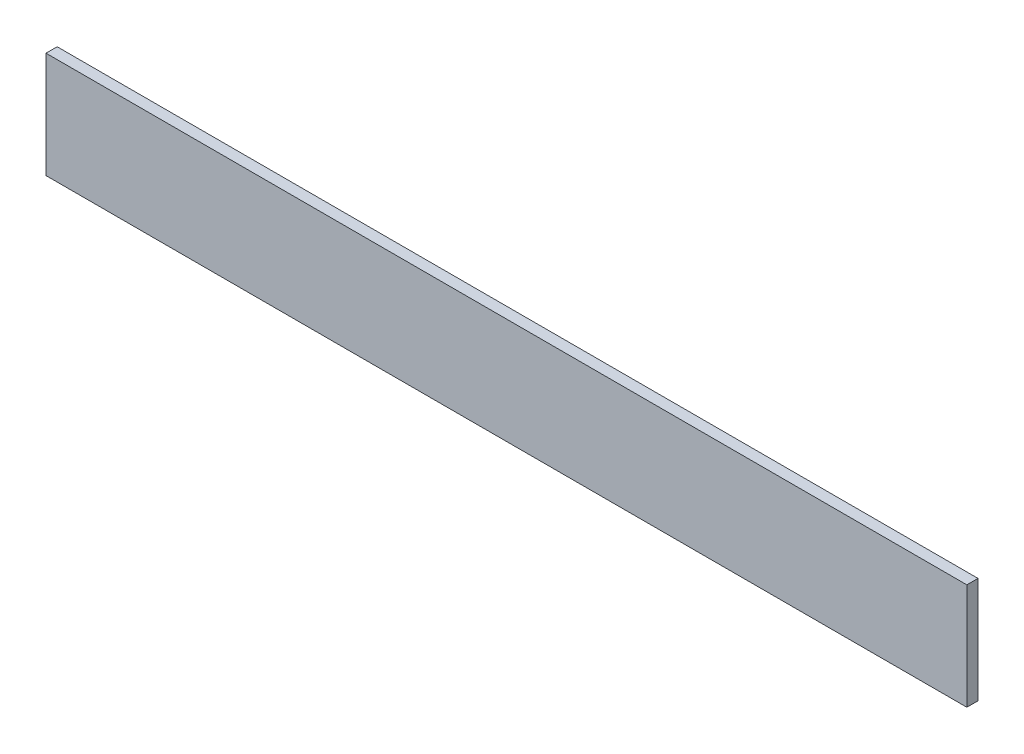
ISO-10303-21;
HEADER;
FILE_DESCRIPTION(('STEP AP214'),'2;1');
FILE_NAME('part.step','',(''),(''),'','','');
FILE_SCHEMA(('AUTOMOTIVE_DESIGN { 1 0 10303 214 1 1 1 1 }'));
ENDSEC;
DATA;
#1=APPLICATION_CONTEXT('core data for automotive mechanical design processes');
#2=APPLICATION_PROTOCOL_DEFINITION('international standard','automotive_design',2000,#1);
#3=PRODUCT_CONTEXT('',#1,'mechanical');
#4=PRODUCT('Part','Part','',(#3));
#5=PRODUCT_RELATED_PRODUCT_CATEGORY('part','',(#4));
#6=PRODUCT_DEFINITION_FORMATION('','',#4);
#7=PRODUCT_DEFINITION_CONTEXT('part definition',#1,'design');
#8=PRODUCT_DEFINITION('design','',#6,#7);
#9=PRODUCT_DEFINITION_SHAPE('','',#8);
#10=(LENGTH_UNIT() NAMED_UNIT(*) SI_UNIT(.MILLI.,.METRE.));
#11=(NAMED_UNIT(*) PLANE_ANGLE_UNIT() SI_UNIT($,.RADIAN.));
#12=(NAMED_UNIT(*) SI_UNIT($,.STERADIAN.) SOLID_ANGLE_UNIT());
#13=UNCERTAINTY_MEASURE_WITH_UNIT(LENGTH_MEASURE(1.E-05),#10,'distance_accuracy_value','');
#14=(GEOMETRIC_REPRESENTATION_CONTEXT(3) GLOBAL_UNCERTAINTY_ASSIGNED_CONTEXT((#13)) GLOBAL_UNIT_ASSIGNED_CONTEXT((#10,
#11,#12)) REPRESENTATION_CONTEXT('',''));
#15=CARTESIAN_POINT('',(0.,0.,0.));
#16=DIRECTION('',(0.,0.,1.));
#17=DIRECTION('',(1.,0.,0.));
#18=AXIS2_PLACEMENT_3D('',#15,#16,#17);
#19=CARTESIAN_POINT('',(0.,0.,8.));
#20=DIRECTION('',(1.,0.,0.));
#21=DIRECTION('',(0.,1.,0.));
#22=AXIS2_PLACEMENT_3D('',#19,#20,#21);
#23=PLANE('',#22);
#24=DIRECTION('',(0.,-1.,0.));
#25=VECTOR('',#24,1.);
#26=CARTESIAN_POINT('',(0.,0.,0.));
#27=LINE('',#26,#25);
#28=CARTESIAN_POINT('',(0.,0.,0.));
#29=VERTEX_POINT('',#28);
#30=CARTESIAN_POINT('',(0.,-76.,0.));
#31=VERTEX_POINT('',#30);
#32=EDGE_CURVE('E98',#29,#31,#27,.T.);
#33=ORIENTED_EDGE('',*,*,#32,.T.);
#34=DIRECTION('',(0.,0.,-1.));
#35=VECTOR('',#34,1.);
#36=CARTESIAN_POINT('',(0.,-76.,8.));
#37=LINE('',#36,#35);
#38=CARTESIAN_POINT('',(0.,-76.,8.));
#39=VERTEX_POINT('',#38);
#40=EDGE_CURVE('E11',#39,#31,#37,.T.);
#41=ORIENTED_EDGE('',*,*,#40,.F.);
#42=DIRECTION('',(0.,-1.,0.));
#43=VECTOR('',#42,1.);
#44=CARTESIAN_POINT('',(0.,0.,8.));
#45=LINE('',#44,#43);
#46=CARTESIAN_POINT('',(0.,0.,8.));
#47=VERTEX_POINT('',#46);
#48=EDGE_CURVE('E86',#47,#39,#45,.T.);
#49=ORIENTED_EDGE('',*,*,#48,.F.);
#50=DIRECTION('',(0.,0.,-1.));
#51=VECTOR('',#50,1.);
#52=CARTESIAN_POINT('',(0.,0.,8.));
#53=LINE('',#52,#51);
#54=EDGE_CURVE('E94',#47,#29,#53,.T.);
#55=ORIENTED_EDGE('',*,*,#54,.T.);
#56=EDGE_LOOP('',(#33,#41,#49,#55));
#57=FACE_BOUND('',#56,.T.);
#58=ADVANCED_FACE('F35',(#57),#23,.F.);
#59=CARTESIAN_POINT('',(0.,-76.,8.));
#60=DIRECTION('',(0.,1.,0.));
#61=DIRECTION('',(0.,0.,1.));
#62=AXIS2_PLACEMENT_3D('',#59,#60,#61);
#63=PLANE('',#62);
#64=DIRECTION('',(1.,0.,0.));
#65=VECTOR('',#64,1.);
#66=CARTESIAN_POINT('',(0.,-76.,0.));
#67=LINE('',#66,#65);
#68=CARTESIAN_POINT('',(660.,-76.,0.));
#69=VERTEX_POINT('',#68);
#70=EDGE_CURVE('E90',#31,#69,#67,.T.);
#71=ORIENTED_EDGE('',*,*,#70,.T.);
#72=DIRECTION('',(0.,0.,-1.));
#73=VECTOR('',#72,1.);
#74=CARTESIAN_POINT('',(660.,-76.,8.));
#75=LINE('',#74,#73);
#76=CARTESIAN_POINT('',(660.,-76.,8.));
#77=VERTEX_POINT('',#76);
#78=EDGE_CURVE('E43',#77,#69,#75,.T.);
#79=ORIENTED_EDGE('',*,*,#78,.F.);
#80=DIRECTION('',(1.,0.,0.));
#81=VECTOR('',#80,1.);
#82=CARTESIAN_POINT('',(0.,-76.,8.));
#83=LINE('',#82,#81);
#84=EDGE_CURVE('E81',#39,#77,#83,.T.);
#85=ORIENTED_EDGE('',*,*,#84,.F.);
#86=ORIENTED_EDGE('',*,*,#40,.T.);
#87=EDGE_LOOP('',(#71,#79,#85,#86));
#88=FACE_BOUND('',#87,.T.);
#89=ADVANCED_FACE('F89',(#88),#63,.F.);
#90=CARTESIAN_POINT('',(660.,0.,8.));
#91=DIRECTION('',(-1.,0.,0.));
#92=DIRECTION('',(0.,0.,1.));
#93=AXIS2_PLACEMENT_3D('',#90,#91,#92);
#94=PLANE('',#93);
#95=DIRECTION('',(0.,1.,0.));
#96=VECTOR('',#95,1.);
#97=CARTESIAN_POINT('',(660.,0.,0.));
#98=LINE('',#97,#96);
#99=CARTESIAN_POINT('',(660.,0.,0.));
#100=VERTEX_POINT('',#99);
#101=EDGE_CURVE('E68',#69,#100,#98,.T.);
#102=ORIENTED_EDGE('',*,*,#101,.T.);
#103=DIRECTION('',(0.,0.,-1.));
#104=VECTOR('',#103,1.);
#105=CARTESIAN_POINT('',(660.,0.,8.));
#106=LINE('',#105,#104);
#107=CARTESIAN_POINT('',(660.,0.,8.));
#108=VERTEX_POINT('',#107);
#109=EDGE_CURVE('E91',#108,#100,#106,.T.);
#110=ORIENTED_EDGE('',*,*,#109,.F.);
#111=DIRECTION('',(0.,1.,0.));
#112=VECTOR('',#111,1.);
#113=CARTESIAN_POINT('',(660.,0.,8.));
#114=LINE('',#113,#112);
#115=EDGE_CURVE('E84',#77,#108,#114,.T.);
#116=ORIENTED_EDGE('',*,*,#115,.F.);
#117=ORIENTED_EDGE('',*,*,#78,.T.);
#118=EDGE_LOOP('',(#102,#110,#116,#117));
#119=FACE_BOUND('',#118,.T.);
#120=ADVANCED_FACE('F92',(#119),#94,.F.);
#121=CARTESIAN_POINT('',(0.,0.,8.));
#122=DIRECTION('',(0.,-1.,0.));
#123=DIRECTION('',(0.,0.,-1.));
#124=AXIS2_PLACEMENT_3D('',#121,#122,#123);
#125=PLANE('',#124);
#126=DIRECTION('',(-1.,0.,0.));
#127=VECTOR('',#126,1.);
#128=CARTESIAN_POINT('',(0.,0.,0.));
#129=LINE('',#128,#127);
#130=EDGE_CURVE('E74',#100,#29,#129,.T.);
#131=ORIENTED_EDGE('',*,*,#130,.T.);
#132=ORIENTED_EDGE('',*,*,#54,.F.);
#133=DIRECTION('',(-1.,0.,0.));
#134=VECTOR('',#133,1.);
#135=CARTESIAN_POINT('',(0.,0.,8.));
#136=LINE('',#135,#134);
#137=EDGE_CURVE('E51',#108,#47,#136,.T.);
#138=ORIENTED_EDGE('',*,*,#137,.F.);
#139=ORIENTED_EDGE('',*,*,#109,.T.);
#140=EDGE_LOOP('',(#131,#132,#138,#139));
#141=FACE_BOUND('',#140,.T.);
#142=ADVANCED_FACE('F105',(#141),#125,.F.);
#143=CARTESIAN_POINT('',(0.,0.,8.));
#144=DIRECTION('',(0.,0.,1.));
#145=DIRECTION('',(1.,0.,0.));
#146=AXIS2_PLACEMENT_3D('',#143,#144,#145);
#147=PLANE('',#146);
#148=ORIENTED_EDGE('',*,*,#48,.T.);
#149=ORIENTED_EDGE('',*,*,#84,.T.);
#150=ORIENTED_EDGE('',*,*,#115,.T.);
#151=ORIENTED_EDGE('',*,*,#137,.T.);
#152=EDGE_LOOP('',(#148,#149,#150,#151));
#153=FACE_BOUND('',#152,.T.);
#154=ADVANCED_FACE('F82',(#153),#147,.T.);
#155=CARTESIAN_POINT('',(0.,0.,0.));
#156=DIRECTION('',(0.,0.,1.));
#157=DIRECTION('',(1.,0.,0.));
#158=AXIS2_PLACEMENT_3D('',#155,#156,#157);
#159=PLANE('',#158);
#160=ORIENTED_EDGE('',*,*,#32,.F.);
#161=ORIENTED_EDGE('',*,*,#130,.F.);
#162=ORIENTED_EDGE('',*,*,#101,.F.);
#163=ORIENTED_EDGE('',*,*,#70,.F.);
#164=EDGE_LOOP('',(#160,#161,#162,#163));
#165=FACE_BOUND('',#164,.T.);
#166=ADVANCED_FACE('F108',(#165),#159,.F.);
#167=CLOSED_SHELL('',(#58,#89,#120,#142,#154,#166));
#168=MANIFOLD_SOLID_BREP('B2',#167);
#169=ADVANCED_BREP_SHAPE_REPRESENTATION('',(#18,#168),#14);
#170=SHAPE_DEFINITION_REPRESENTATION(#9,#169);
ENDSEC;
END-ISO-10303-21;
